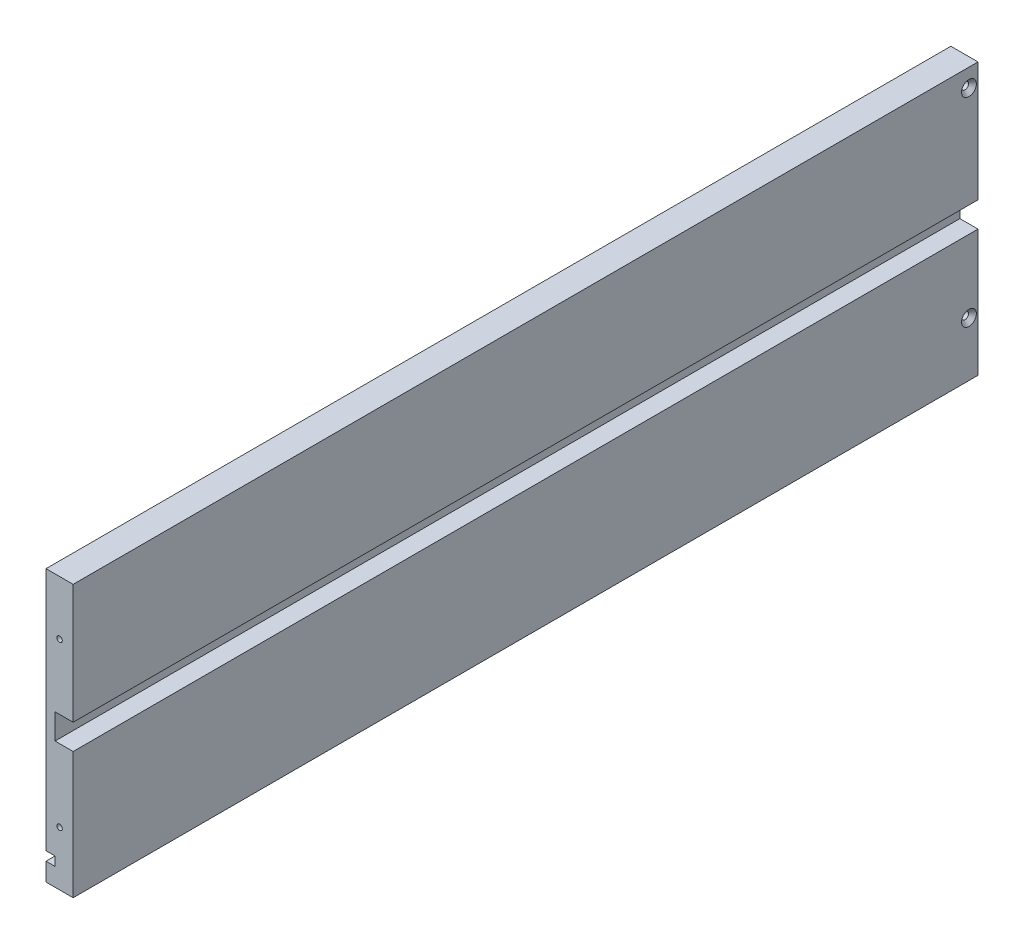
ISO-10303-21;
HEADER;
FILE_DESCRIPTION(('STEP AP214'),'2;1');
FILE_NAME('part.step','',(''),(''),'','','');
FILE_SCHEMA(('AUTOMOTIVE_DESIGN { 1 0 10303 214 1 1 1 1 }'));
ENDSEC;
DATA;
#1=APPLICATION_CONTEXT('core data for automotive mechanical design processes');
#2=APPLICATION_PROTOCOL_DEFINITION('international standard','automotive_design',2000,#1);
#3=PRODUCT_CONTEXT('',#1,'mechanical');
#4=PRODUCT('Part','Part','',(#3));
#5=PRODUCT_RELATED_PRODUCT_CATEGORY('part','',(#4));
#6=PRODUCT_DEFINITION_FORMATION('','',#4);
#7=PRODUCT_DEFINITION_CONTEXT('part definition',#1,'design');
#8=PRODUCT_DEFINITION('design','',#6,#7);
#9=PRODUCT_DEFINITION_SHAPE('','',#8);
#10=(LENGTH_UNIT() NAMED_UNIT(*) SI_UNIT(.MILLI.,.METRE.));
#11=(NAMED_UNIT(*) PLANE_ANGLE_UNIT() SI_UNIT($,.RADIAN.));
#12=(NAMED_UNIT(*) SI_UNIT($,.STERADIAN.) SOLID_ANGLE_UNIT());
#13=UNCERTAINTY_MEASURE_WITH_UNIT(LENGTH_MEASURE(1.E-05),#10,'distance_accuracy_value','');
#14=(GEOMETRIC_REPRESENTATION_CONTEXT(3) GLOBAL_UNCERTAINTY_ASSIGNED_CONTEXT((#13)) GLOBAL_UNIT_ASSIGNED_CONTEXT((#10,
#11,#12)) REPRESENTATION_CONTEXT('',''));
#15=CARTESIAN_POINT('',(0.,0.,0.));
#16=DIRECTION('',(0.,0.,1.));
#17=DIRECTION('',(1.,0.,0.));
#18=AXIS2_PLACEMENT_3D('',#15,#16,#17);
#19=CARTESIAN_POINT('',(-15.,150.,0.));
#20=DIRECTION('',(-1.,0.,0.));
#21=DIRECTION('',(0.,0.,1.));
#22=AXIS2_PLACEMENT_3D('',#19,#20,#21);
#23=PLANE('',#22);
#24=CARTESIAN_POINT('',(-15.,140.,-495.));
#25=DIRECTION('',(1.,0.,0.));
#26=DIRECTION('',(0.,0.,-1.));
#27=AXIS2_PLACEMENT_3D('',#24,#25,#26);
#28=CIRCLE('',#27,1.95000000000001);
#29=CARTESIAN_POINT('',(-15.,140.,-496.95));
#30=VERTEX_POINT('',#29);
#31=EDGE_CURVE('E147',#30,#30,#28,.T.);
#32=ORIENTED_EDGE('',*,*,#31,.T.);
#33=EDGE_LOOP('',(#32));
#34=FACE_BOUND('',#33,.T.);
#35=CARTESIAN_POINT('',(-15.,30.,-495.));
#36=DIRECTION('',(1.,0.,0.));
#37=DIRECTION('',(0.,0.,-1.));
#38=AXIS2_PLACEMENT_3D('',#35,#36,#37);
#39=CIRCLE('',#38,1.94999999999999);
#40=CARTESIAN_POINT('',(-15.,30.,-496.95));
#41=VERTEX_POINT('',#40);
#42=EDGE_CURVE('E156',#41,#41,#39,.T.);
#43=ORIENTED_EDGE('',*,*,#42,.T.);
#44=EDGE_LOOP('',(#43));
#45=FACE_BOUND('',#44,.T.);
#46=DIRECTION('',(0.,0.,1.));
#47=VECTOR('',#46,1.);
#48=CARTESIAN_POINT('',(-15.,15.,-500.));
#49=LINE('',#48,#47);
#50=CARTESIAN_POINT('',(-15.,15.,-500.));
#51=VERTEX_POINT('',#50);
#52=CARTESIAN_POINT('',(-15.,15.,0.));
#53=VERTEX_POINT('',#52);
#54=EDGE_CURVE('E181',#51,#53,#49,.T.);
#55=ORIENTED_EDGE('',*,*,#54,.T.);
#56=DIRECTION('',(0.,-1.,0.));
#57=VECTOR('',#56,1.);
#58=CARTESIAN_POINT('',(-15.,0.,0.));
#59=LINE('',#58,#57);
#60=CARTESIAN_POINT('',(-15.,150.,0.));
#61=VERTEX_POINT('',#60);
#62=EDGE_CURVE('E214',#61,#53,#59,.T.);
#63=ORIENTED_EDGE('',*,*,#62,.F.);
#64=DIRECTION('',(0.,0.,1.));
#65=VECTOR('',#64,1.);
#66=CARTESIAN_POINT('',(-15.,150.,0.));
#67=LINE('',#66,#65);
#68=CARTESIAN_POINT('',(-15.,150.,-500.));
#69=VERTEX_POINT('',#68);
#70=EDGE_CURVE('E225',#69,#61,#67,.T.);
#71=ORIENTED_EDGE('',*,*,#70,.F.);
#72=DIRECTION('',(0.,1.,0.));
#73=VECTOR('',#72,1.);
#74=CARTESIAN_POINT('',(-15.,0.,-500.));
#75=LINE('',#74,#73);
#76=EDGE_CURVE('E221',#51,#69,#75,.T.);
#77=ORIENTED_EDGE('',*,*,#76,.F.);
#78=EDGE_LOOP('',(#55,#63,#71,#77));
#79=FACE_BOUND('',#78,.T.);
#80=ADVANCED_FACE('F33',(#34,#45,#79),#23,.T.);
#81=CARTESIAN_POINT('',(0.,150.,0.));
#82=DIRECTION('',(-1.,0.,0.));
#83=DIRECTION('',(0.,0.,1.));
#84=AXIS2_PLACEMENT_3D('',#81,#82,#83);
#85=PLANE('',#84);
#86=CARTESIAN_POINT('',(0.,30.,-495.));
#87=DIRECTION('',(1.,0.,0.));
#88=DIRECTION('',(0.,0.,-1.));
#89=AXIS2_PLACEMENT_3D('',#86,#87,#88);
#90=CIRCLE('',#89,4.1);
#91=CARTESIAN_POINT('',(0.,30.,-499.1));
#92=VERTEX_POINT('',#91);
#93=EDGE_CURVE('E162',#92,#92,#90,.T.);
#94=ORIENTED_EDGE('',*,*,#93,.F.);
#95=EDGE_LOOP('',(#94));
#96=FACE_BOUND('',#95,.T.);
#97=DIRECTION('',(0.,1.,0.));
#98=VECTOR('',#97,1.);
#99=CARTESIAN_POINT('',(0.,0.,-500.));
#100=LINE('',#99,#98);
#101=CARTESIAN_POINT('',(0.,0.,-500.));
#102=VERTEX_POINT('',#101);
#103=CARTESIAN_POINT('',(0.,70.,-500.));
#104=VERTEX_POINT('',#103);
#105=EDGE_CURVE('E235',#102,#104,#100,.T.);
#106=ORIENTED_EDGE('',*,*,#105,.T.);
#107=DIRECTION('',(0.,0.,1.));
#108=VECTOR('',#107,1.);
#109=CARTESIAN_POINT('',(0.,70.,-500.));
#110=LINE('',#109,#108);
#111=CARTESIAN_POINT('',(0.,70.,0.));
#112=VERTEX_POINT('',#111);
#113=EDGE_CURVE('E205',#104,#112,#110,.T.);
#114=ORIENTED_EDGE('',*,*,#113,.T.);
#115=DIRECTION('',(0.,-1.,0.));
#116=VECTOR('',#115,1.);
#117=CARTESIAN_POINT('',(0.,0.,0.));
#118=LINE('',#117,#116);
#119=CARTESIAN_POINT('',(0.,0.,0.));
#120=VERTEX_POINT('',#119);
#121=EDGE_CURVE('E208',#112,#120,#118,.T.);
#122=ORIENTED_EDGE('',*,*,#121,.T.);
#123=DIRECTION('',(0.,0.,-1.));
#124=VECTOR('',#123,1.);
#125=CARTESIAN_POINT('',(0.,0.,0.));
#126=LINE('',#125,#124);
#127=EDGE_CURVE('E231',#120,#102,#126,.T.);
#128=ORIENTED_EDGE('',*,*,#127,.T.);
#129=EDGE_LOOP('',(#106,#114,#122,#128));
#130=FACE_BOUND('',#129,.T.);
#131=ADVANCED_FACE('F257',(#96,#130),#85,.F.);
#132=CARTESIAN_POINT('',(-15.,0.,0.));
#133=DIRECTION('',(0.,0.,1.));
#134=DIRECTION('',(1.,0.,0.));
#135=AXIS2_PLACEMENT_3D('',#132,#133,#134);
#136=PLANE('',#135);
#137=CARTESIAN_POINT('',(-7.5,30.,0.));
#138=DIRECTION('',(0.,0.,1.));
#139=DIRECTION('',(1.,0.,0.));
#140=AXIS2_PLACEMENT_3D('',#137,#138,#139);
#141=CIRCLE('',#140,1.5);
#142=CARTESIAN_POINT('',(-6.00000000000001,30.,0.));
#143=VERTEX_POINT('',#142);
#144=EDGE_CURVE('E136',#143,#143,#141,.T.);
#145=ORIENTED_EDGE('',*,*,#144,.F.);
#146=EDGE_LOOP('',(#145));
#147=FACE_BOUND('',#146,.T.);
#148=CARTESIAN_POINT('',(-7.50000000000001,120.,0.));
#149=DIRECTION('',(0.,0.,1.));
#150=DIRECTION('',(1.,0.,0.));
#151=AXIS2_PLACEMENT_3D('',#148,#149,#150);
#152=CIRCLE('',#151,1.5);
#153=CARTESIAN_POINT('',(-6.00000000000002,120.,0.));
#154=VERTEX_POINT('',#153);
#155=EDGE_CURVE('E144',#154,#154,#152,.T.);
#156=ORIENTED_EDGE('',*,*,#155,.F.);
#157=EDGE_LOOP('',(#156));
#158=FACE_BOUND('',#157,.T.);
#159=DIRECTION('',(-1.,0.,0.));
#160=VECTOR('',#159,1.);
#161=CARTESIAN_POINT('',(-15.,15.,0.));
#162=LINE('',#161,#160);
#163=CARTESIAN_POINT('',(-10.,15.,0.));
#164=VERTEX_POINT('',#163);
#165=EDGE_CURVE('E168',#164,#53,#162,.T.);
#166=ORIENTED_EDGE('',*,*,#165,.F.);
#167=DIRECTION('',(0.,1.,0.));
#168=VECTOR('',#167,1.);
#169=CARTESIAN_POINT('',(-10.,10.,0.));
#170=LINE('',#169,#168);
#171=CARTESIAN_POINT('',(-10.,10.,0.));
#172=VERTEX_POINT('',#171);
#173=EDGE_CURVE('E177',#172,#164,#170,.T.);
#174=ORIENTED_EDGE('',*,*,#173,.F.);
#175=DIRECTION('',(1.,0.,0.));
#176=VECTOR('',#175,1.);
#177=CARTESIAN_POINT('',(-15.,10.,0.));
#178=LINE('',#177,#176);
#179=CARTESIAN_POINT('',(-15.,10.,0.));
#180=VERTEX_POINT('',#179);
#181=EDGE_CURVE('E165',#180,#172,#178,.T.);
#182=ORIENTED_EDGE('',*,*,#181,.F.);
#183=CARTESIAN_POINT('',(-15.,0.,0.));
#184=VERTEX_POINT('',#183);
#185=EDGE_CURVE('E218',#180,#184,#59,.T.);
#186=ORIENTED_EDGE('',*,*,#185,.T.);
#187=DIRECTION('',(1.,0.,0.));
#188=VECTOR('',#187,1.);
#189=CARTESIAN_POINT('',(-15.,0.,0.));
#190=LINE('',#189,#188);
#191=EDGE_CURVE('E37',#184,#120,#190,.T.);
#192=ORIENTED_EDGE('',*,*,#191,.T.);
#193=ORIENTED_EDGE('',*,*,#121,.F.);
#194=DIRECTION('',(1.,0.,0.));
#195=VECTOR('',#194,1.);
#196=CARTESIAN_POINT('',(0.,70.,0.));
#197=LINE('',#196,#195);
#198=CARTESIAN_POINT('',(-10.,70.,0.));
#199=VERTEX_POINT('',#198);
#200=EDGE_CURVE('E192',#199,#112,#197,.T.);
#201=ORIENTED_EDGE('',*,*,#200,.F.);
#202=DIRECTION('',(0.,-1.,0.));
#203=VECTOR('',#202,1.);
#204=CARTESIAN_POINT('',(-10.,70.,0.));
#205=LINE('',#204,#203);
#206=CARTESIAN_POINT('',(-10.,84.,0.));
#207=VERTEX_POINT('',#206);
#208=EDGE_CURVE('E201',#207,#199,#205,.T.);
#209=ORIENTED_EDGE('',*,*,#208,.F.);
#210=DIRECTION('',(-1.,0.,0.));
#211=VECTOR('',#210,1.);
#212=CARTESIAN_POINT('',(0.,84.,0.));
#213=LINE('',#212,#211);
#214=CARTESIAN_POINT('',(0.,84.,0.));
#215=VERTEX_POINT('',#214);
#216=EDGE_CURVE('E184',#215,#207,#213,.T.);
#217=ORIENTED_EDGE('',*,*,#216,.F.);
#218=CARTESIAN_POINT('',(0.,150.,0.));
#219=VERTEX_POINT('',#218);
#220=EDGE_CURVE('E228',#219,#215,#118,.T.);
#221=ORIENTED_EDGE('',*,*,#220,.F.);
#222=DIRECTION('',(1.,0.,0.));
#223=VECTOR('',#222,1.);
#224=CARTESIAN_POINT('',(-15.,150.,0.));
#225=LINE('',#224,#223);
#226=EDGE_CURVE('E11',#61,#219,#225,.T.);
#227=ORIENTED_EDGE('',*,*,#226,.F.);
#228=ORIENTED_EDGE('',*,*,#62,.T.);
#229=EDGE_LOOP('',(#166,#174,#182,#186,#192,#193,#201,#209,#217,#221,#227,#228));
#230=FACE_BOUND('',#229,.T.);
#231=ADVANCED_FACE('F35',(#147,#158,#230),#136,.T.);
#232=CARTESIAN_POINT('',(-15.,150.,0.));
#233=DIRECTION('',(0.,1.,0.));
#234=DIRECTION('',(0.,0.,1.));
#235=AXIS2_PLACEMENT_3D('',#232,#233,#234);
#236=PLANE('',#235);
#237=DIRECTION('',(0.,0.,1.));
#238=VECTOR('',#237,1.);
#239=CARTESIAN_POINT('',(0.,150.,0.));
#240=LINE('',#239,#238);
#241=CARTESIAN_POINT('',(0.,150.,-500.));
#242=VERTEX_POINT('',#241);
#243=EDGE_CURVE('E238',#242,#219,#240,.T.);
#244=ORIENTED_EDGE('',*,*,#243,.F.);
#245=DIRECTION('',(1.,0.,0.));
#246=VECTOR('',#245,1.);
#247=CARTESIAN_POINT('',(-15.,150.,-500.));
#248=LINE('',#247,#246);
#249=EDGE_CURVE('E42',#69,#242,#248,.T.);
#250=ORIENTED_EDGE('',*,*,#249,.F.);
#251=ORIENTED_EDGE('',*,*,#70,.T.);
#252=ORIENTED_EDGE('',*,*,#226,.T.);
#253=EDGE_LOOP('',(#244,#250,#251,#252));
#254=FACE_BOUND('',#253,.T.);
#255=ADVANCED_FACE('F275',(#254),#236,.T.);
#256=CARTESIAN_POINT('',(-15.,0.,-500.));
#257=DIRECTION('',(0.,0.,-1.));
#258=DIRECTION('',(-1.,0.,0.));
#259=AXIS2_PLACEMENT_3D('',#256,#257,#258);
#260=PLANE('',#259);
#261=DIRECTION('',(-1.,0.,0.));
#262=VECTOR('',#261,1.);
#263=CARTESIAN_POINT('',(-15.,15.,-500.));
#264=LINE('',#263,#262);
#265=CARTESIAN_POINT('',(-10.,15.,-500.));
#266=VERTEX_POINT('',#265);
#267=EDGE_CURVE('E171',#266,#51,#264,.T.);
#268=ORIENTED_EDGE('',*,*,#267,.T.);
#269=ORIENTED_EDGE('',*,*,#76,.T.);
#270=ORIENTED_EDGE('',*,*,#249,.T.);
#271=CARTESIAN_POINT('',(0.,84.,-500.));
#272=VERTEX_POINT('',#271);
#273=EDGE_CURVE('E234',#272,#242,#100,.T.);
#274=ORIENTED_EDGE('',*,*,#273,.F.);
#275=DIRECTION('',(-1.,0.,0.));
#276=VECTOR('',#275,1.);
#277=CARTESIAN_POINT('',(0.,84.,-500.));
#278=LINE('',#277,#276);
#279=CARTESIAN_POINT('',(-10.,84.,-500.));
#280=VERTEX_POINT('',#279);
#281=EDGE_CURVE('E58',#272,#280,#278,.T.);
#282=ORIENTED_EDGE('',*,*,#281,.T.);
#283=DIRECTION('',(0.,-1.,0.));
#284=VECTOR('',#283,1.);
#285=CARTESIAN_POINT('',(-10.,70.,-500.));
#286=LINE('',#285,#284);
#287=CARTESIAN_POINT('',(-10.,70.,-500.));
#288=VERTEX_POINT('',#287);
#289=EDGE_CURVE('E191',#280,#288,#286,.T.);
#290=ORIENTED_EDGE('',*,*,#289,.T.);
#291=DIRECTION('',(1.,0.,0.));
#292=VECTOR('',#291,1.);
#293=CARTESIAN_POINT('',(0.,70.,-500.));
#294=LINE('',#293,#292);
#295=EDGE_CURVE('E195',#288,#104,#294,.T.);
#296=ORIENTED_EDGE('',*,*,#295,.T.);
#297=ORIENTED_EDGE('',*,*,#105,.F.);
#298=DIRECTION('',(1.,0.,0.));
#299=VECTOR('',#298,1.);
#300=CARTESIAN_POINT('',(-15.,0.,-500.));
#301=LINE('',#300,#299);
#302=CARTESIAN_POINT('',(-15.,0.,-500.));
#303=VERTEX_POINT('',#302);
#304=EDGE_CURVE('E242',#303,#102,#301,.T.);
#305=ORIENTED_EDGE('',*,*,#304,.F.);
#306=CARTESIAN_POINT('',(-15.,10.,-500.));
#307=VERTEX_POINT('',#306);
#308=EDGE_CURVE('E222',#303,#307,#75,.T.);
#309=ORIENTED_EDGE('',*,*,#308,.T.);
#310=DIRECTION('',(1.,0.,0.));
#311=VECTOR('',#310,1.);
#312=CARTESIAN_POINT('',(-15.,10.,-500.));
#313=LINE('',#312,#311);
#314=CARTESIAN_POINT('',(-10.,10.,-500.));
#315=VERTEX_POINT('',#314);
#316=EDGE_CURVE('E50',#307,#315,#313,.T.);
#317=ORIENTED_EDGE('',*,*,#316,.T.);
#318=DIRECTION('',(0.,1.,0.));
#319=VECTOR('',#318,1.);
#320=CARTESIAN_POINT('',(-10.,10.,-500.));
#321=LINE('',#320,#319);
#322=EDGE_CURVE('E167',#315,#266,#321,.T.);
#323=ORIENTED_EDGE('',*,*,#322,.T.);
#324=EDGE_LOOP('',(#268,#269,#270,#274,#282,#290,#296,#297,#305,#309,#317,#323));
#325=FACE_BOUND('',#324,.T.);
#326=ADVANCED_FACE('F262',(#325),#260,.T.);
#327=CARTESIAN_POINT('',(-15.,0.,0.));
#328=DIRECTION('',(0.,-1.,0.));
#329=DIRECTION('',(0.,0.,-1.));
#330=AXIS2_PLACEMENT_3D('',#327,#328,#329);
#331=PLANE('',#330);
#332=ORIENTED_EDGE('',*,*,#127,.F.);
#333=ORIENTED_EDGE('',*,*,#191,.F.);
#334=DIRECTION('',(0.,0.,-1.));
#335=VECTOR('',#334,1.);
#336=CARTESIAN_POINT('',(-15.,0.,0.));
#337=LINE('',#336,#335);
#338=EDGE_CURVE('E217',#184,#303,#337,.T.);
#339=ORIENTED_EDGE('',*,*,#338,.T.);
#340=ORIENTED_EDGE('',*,*,#304,.T.);
#341=EDGE_LOOP('',(#332,#333,#339,#340));
#342=FACE_BOUND('',#341,.T.);
#343=ADVANCED_FACE('F255',(#342),#331,.T.);
#344=DIRECTION('',(0.,0.,1.));
#345=VECTOR('',#344,1.);
#346=CARTESIAN_POINT('',(-15.,10.,-500.));
#347=LINE('',#346,#345);
#348=EDGE_CURVE('E174',#307,#180,#347,.T.);
#349=ORIENTED_EDGE('',*,*,#348,.F.);
#350=ORIENTED_EDGE('',*,*,#308,.F.);
#351=ORIENTED_EDGE('',*,*,#338,.F.);
#352=ORIENTED_EDGE('',*,*,#185,.F.);
#353=EDGE_LOOP('',(#349,#350,#351,#352));
#354=FACE_BOUND('',#353,.T.);
#355=ADVANCED_FACE('F288',(#354),#23,.T.);
#356=CARTESIAN_POINT('',(0.,140.,-495.));
#357=DIRECTION('',(1.,0.,0.));
#358=DIRECTION('',(0.,0.,-1.));
#359=AXIS2_PLACEMENT_3D('',#356,#357,#358);
#360=CIRCLE('',#359,4.09999999999999);
#361=CARTESIAN_POINT('',(0.,140.,-499.1));
#362=VERTEX_POINT('',#361);
#363=EDGE_CURVE('E153',#362,#362,#360,.T.);
#364=ORIENTED_EDGE('',*,*,#363,.F.);
#365=EDGE_LOOP('',(#364));
#366=FACE_BOUND('',#365,.T.);
#367=ORIENTED_EDGE('',*,*,#220,.T.);
#368=DIRECTION('',(0.,0.,1.));
#369=VECTOR('',#368,1.);
#370=CARTESIAN_POINT('',(0.,84.,-500.));
#371=LINE('',#370,#369);
#372=EDGE_CURVE('E198',#272,#215,#371,.T.);
#373=ORIENTED_EDGE('',*,*,#372,.F.);
#374=ORIENTED_EDGE('',*,*,#273,.T.);
#375=ORIENTED_EDGE('',*,*,#243,.T.);
#376=EDGE_LOOP('',(#367,#373,#374,#375));
#377=FACE_BOUND('',#376,.T.);
#378=ADVANCED_FACE('F271',(#366,#377),#85,.F.);
#379=CARTESIAN_POINT('',(0.,70.,-500.));
#380=DIRECTION('',(0.,-1.,0.));
#381=DIRECTION('',(0.,0.,-1.));
#382=AXIS2_PLACEMENT_3D('',#379,#380,#381);
#383=PLANE('',#382);
#384=ORIENTED_EDGE('',*,*,#200,.T.);
#385=ORIENTED_EDGE('',*,*,#113,.F.);
#386=ORIENTED_EDGE('',*,*,#295,.F.);
#387=DIRECTION('',(0.,0.,1.));
#388=VECTOR('',#387,1.);
#389=CARTESIAN_POINT('',(-10.,70.,-500.));
#390=LINE('',#389,#388);
#391=EDGE_CURVE('E209',#288,#199,#390,.T.);
#392=ORIENTED_EDGE('',*,*,#391,.T.);
#393=EDGE_LOOP('',(#384,#385,#386,#392));
#394=FACE_BOUND('',#393,.T.);
#395=ADVANCED_FACE('F260',(#394),#383,.F.);
#396=CARTESIAN_POINT('',(-10.,70.,-500.));
#397=DIRECTION('',(-1.,0.,0.));
#398=DIRECTION('',(0.,0.,1.));
#399=AXIS2_PLACEMENT_3D('',#396,#397,#398);
#400=PLANE('',#399);
#401=ORIENTED_EDGE('',*,*,#208,.T.);
#402=ORIENTED_EDGE('',*,*,#391,.F.);
#403=ORIENTED_EDGE('',*,*,#289,.F.);
#404=DIRECTION('',(0.,0.,1.));
#405=VECTOR('',#404,1.);
#406=CARTESIAN_POINT('',(-10.,84.,-500.));
#407=LINE('',#406,#405);
#408=EDGE_CURVE('E211',#280,#207,#407,.T.);
#409=ORIENTED_EDGE('',*,*,#408,.T.);
#410=EDGE_LOOP('',(#401,#402,#403,#409));
#411=FACE_BOUND('',#410,.T.);
#412=ADVANCED_FACE('F266',(#411),#400,.F.);
#413=CARTESIAN_POINT('',(0.,84.,-500.));
#414=DIRECTION('',(0.,1.,0.));
#415=DIRECTION('',(0.,0.,1.));
#416=AXIS2_PLACEMENT_3D('',#413,#414,#415);
#417=PLANE('',#416);
#418=ORIENTED_EDGE('',*,*,#216,.T.);
#419=ORIENTED_EDGE('',*,*,#408,.F.);
#420=ORIENTED_EDGE('',*,*,#281,.F.);
#421=ORIENTED_EDGE('',*,*,#372,.T.);
#422=EDGE_LOOP('',(#418,#419,#420,#421));
#423=FACE_BOUND('',#422,.T.);
#424=ADVANCED_FACE('F360',(#423),#417,.F.);
#425=CARTESIAN_POINT('',(-15.,15.,-500.));
#426=DIRECTION('',(0.,1.,0.));
#427=DIRECTION('',(0.,0.,1.));
#428=AXIS2_PLACEMENT_3D('',#425,#426,#427);
#429=PLANE('',#428);
#430=ORIENTED_EDGE('',*,*,#165,.T.);
#431=ORIENTED_EDGE('',*,*,#54,.F.);
#432=ORIENTED_EDGE('',*,*,#267,.F.);
#433=DIRECTION('',(0.,0.,1.));
#434=VECTOR('',#433,1.);
#435=CARTESIAN_POINT('',(-10.,15.,-500.));
#436=LINE('',#435,#434);
#437=EDGE_CURVE('E185',#266,#164,#436,.T.);
#438=ORIENTED_EDGE('',*,*,#437,.T.);
#439=EDGE_LOOP('',(#430,#431,#432,#438));
#440=FACE_BOUND('',#439,.T.);
#441=ADVANCED_FACE('F282',(#440),#429,.F.);
#442=CARTESIAN_POINT('',(-10.,10.,-500.));
#443=DIRECTION('',(1.,0.,0.));
#444=DIRECTION('',(0.,0.,-1.));
#445=AXIS2_PLACEMENT_3D('',#442,#443,#444);
#446=PLANE('',#445);
#447=ORIENTED_EDGE('',*,*,#173,.T.);
#448=ORIENTED_EDGE('',*,*,#437,.F.);
#449=ORIENTED_EDGE('',*,*,#322,.F.);
#450=DIRECTION('',(0.,0.,1.));
#451=VECTOR('',#450,1.);
#452=CARTESIAN_POINT('',(-10.,10.,-500.));
#453=LINE('',#452,#451);
#454=EDGE_CURVE('E187',#315,#172,#453,.T.);
#455=ORIENTED_EDGE('',*,*,#454,.T.);
#456=EDGE_LOOP('',(#447,#448,#449,#455));
#457=FACE_BOUND('',#456,.T.);
#458=ADVANCED_FACE('F285',(#457),#446,.F.);
#459=CARTESIAN_POINT('',(-15.,10.,-500.));
#460=DIRECTION('',(0.,-1.,0.));
#461=DIRECTION('',(1.,0.,0.));
#462=AXIS2_PLACEMENT_3D('',#459,#460,#461);
#463=PLANE('',#462);
#464=ORIENTED_EDGE('',*,*,#181,.T.);
#465=ORIENTED_EDGE('',*,*,#454,.F.);
#466=ORIENTED_EDGE('',*,*,#316,.F.);
#467=ORIENTED_EDGE('',*,*,#348,.T.);
#468=EDGE_LOOP('',(#464,#465,#466,#467));
#469=FACE_BOUND('',#468,.T.);
#470=ADVANCED_FACE('F290',(#469),#463,.F.);
#471=CARTESIAN_POINT('',(0.,30.,-495.));
#472=DIRECTION('',(1.,0.,0.));
#473=DIRECTION('',(0.,0.,-1.));
#474=AXIS2_PLACEMENT_3D('',#471,#472,#473);
#475=CONICAL_SURFACE('',#474,4.1,0.785398163397448);
#476=CARTESIAN_POINT('',(-2.15,30.,-495.));
#477=DIRECTION('',(1.,0.,0.));
#478=DIRECTION('',(0.,0.,-1.));
#479=AXIS2_PLACEMENT_3D('',#476,#477,#478);
#480=CIRCLE('',#479,1.95);
#481=CARTESIAN_POINT('',(-2.15,30.,-496.95));
#482=VERTEX_POINT('',#481);
#483=EDGE_CURVE('E159',#482,#482,#480,.T.);
#484=ORIENTED_EDGE('',*,*,#483,.F.);
#485=EDGE_LOOP('',(#484));
#486=FACE_BOUND('',#485,.T.);
#487=ORIENTED_EDGE('',*,*,#93,.T.);
#488=EDGE_LOOP('',(#487));
#489=FACE_BOUND('',#488,.T.);
#490=ADVANCED_FACE('F292',(#486,#489),#475,.F.);
#491=CARTESIAN_POINT('',(0.,30.,-495.));
#492=DIRECTION('',(1.,0.,0.));
#493=DIRECTION('',(0.,0.,-1.));
#494=AXIS2_PLACEMENT_3D('',#491,#492,#493);
#495=CYLINDRICAL_SURFACE('',#494,1.95);
#496=ORIENTED_EDGE('',*,*,#42,.F.);
#497=EDGE_LOOP('',(#496));
#498=FACE_BOUND('',#497,.T.);
#499=ORIENTED_EDGE('',*,*,#483,.T.);
#500=EDGE_LOOP('',(#499));
#501=FACE_BOUND('',#500,.T.);
#502=ADVANCED_FACE('F298',(#498,#501),#495,.F.);
#503=CARTESIAN_POINT('',(0.,140.,-495.));
#504=DIRECTION('',(1.,0.,0.));
#505=DIRECTION('',(0.,0.,-1.));
#506=AXIS2_PLACEMENT_3D('',#503,#504,#505);
#507=CONICAL_SURFACE('',#506,4.09999999999999,0.785398163397445);
#508=CARTESIAN_POINT('',(-2.15,140.,-495.));
#509=DIRECTION('',(1.,0.,0.));
#510=DIRECTION('',(0.,0.,-1.));
#511=AXIS2_PLACEMENT_3D('',#508,#509,#510);
#512=CIRCLE('',#511,1.95000000000001);
#513=CARTESIAN_POINT('',(-2.15,140.,-496.95));
#514=VERTEX_POINT('',#513);
#515=EDGE_CURVE('E150',#514,#514,#512,.T.);
#516=ORIENTED_EDGE('',*,*,#515,.F.);
#517=EDGE_LOOP('',(#516));
#518=FACE_BOUND('',#517,.T.);
#519=ORIENTED_EDGE('',*,*,#363,.T.);
#520=EDGE_LOOP('',(#519));
#521=FACE_BOUND('',#520,.T.);
#522=ADVANCED_FACE('F347',(#518,#521),#507,.F.);
#523=CARTESIAN_POINT('',(0.,140.,-495.));
#524=DIRECTION('',(1.,0.,0.));
#525=DIRECTION('',(0.,0.,-1.));
#526=AXIS2_PLACEMENT_3D('',#523,#524,#525);
#527=CYLINDRICAL_SURFACE('',#526,1.95000000000001);
#528=ORIENTED_EDGE('',*,*,#31,.F.);
#529=EDGE_LOOP('',(#528));
#530=FACE_BOUND('',#529,.T.);
#531=ORIENTED_EDGE('',*,*,#515,.T.);
#532=EDGE_LOOP('',(#531));
#533=FACE_BOUND('',#532,.T.);
#534=ADVANCED_FACE('F338',(#530,#533),#527,.F.);
#535=CARTESIAN_POINT('',(-7.50000000000001,120.,0.));
#536=DIRECTION('',(0.,0.,1.));
#537=DIRECTION('',(1.,0.,0.));
#538=AXIS2_PLACEMENT_3D('',#535,#536,#537);
#539=CYLINDRICAL_SURFACE('',#538,1.5);
#540=CARTESIAN_POINT('',(-7.50000000000001,120.,-10.));
#541=DIRECTION('',(0.,0.,1.));
#542=DIRECTION('',(1.,0.,0.));
#543=AXIS2_PLACEMENT_3D('',#540,#541,#542);
#544=CIRCLE('',#543,1.5);
#545=CARTESIAN_POINT('',(-6.00000000000002,120.,-10.));
#546=VERTEX_POINT('',#545);
#547=EDGE_CURVE('E139',#546,#546,#544,.T.);
#548=ORIENTED_EDGE('',*,*,#547,.F.);
#549=EDGE_LOOP('',(#548));
#550=FACE_BOUND('',#549,.T.);
#551=ORIENTED_EDGE('',*,*,#155,.T.);
#552=EDGE_LOOP('',(#551));
#553=FACE_BOUND('',#552,.T.);
#554=ADVANCED_FACE('F335',(#550,#553),#539,.F.);
#555=CARTESIAN_POINT('',(-7.50000000000001,120.,-10.));
#556=DIRECTION('',(0.,0.,1.));
#557=DIRECTION('',(1.,0.,0.));
#558=AXIS2_PLACEMENT_3D('',#555,#556,#557);
#559=CONICAL_SURFACE('',#558,1.5,1.02974425867665);
#560=CARTESIAN_POINT('',(-7.50000000000002,120.,-10.9012909285413));
#561=VERTEX_POINT('',#560);
#562=VERTEX_LOOP('',#561);
#563=FACE_BOUND('',#562,.T.);
#564=ORIENTED_EDGE('',*,*,#547,.T.);
#565=EDGE_LOOP('',(#564));
#566=FACE_BOUND('',#565,.T.);
#567=ADVANCED_FACE('F337',(#563,#566),#559,.F.);
#568=CARTESIAN_POINT('',(-7.5,30.,0.));
#569=DIRECTION('',(0.,0.,1.));
#570=DIRECTION('',(1.,0.,0.));
#571=AXIS2_PLACEMENT_3D('',#568,#569,#570);
#572=CYLINDRICAL_SURFACE('',#571,1.5);
#573=CARTESIAN_POINT('',(-7.5,30.,-10.));
#574=DIRECTION('',(0.,0.,1.));
#575=DIRECTION('',(1.,0.,0.));
#576=AXIS2_PLACEMENT_3D('',#573,#574,#575);
#577=CIRCLE('',#576,1.5);
#578=CARTESIAN_POINT('',(-6.00000000000001,30.,-10.));
#579=VERTEX_POINT('',#578);
#580=EDGE_CURVE('E134',#579,#579,#577,.T.);
#581=ORIENTED_EDGE('',*,*,#580,.F.);
#582=EDGE_LOOP('',(#581));
#583=FACE_BOUND('',#582,.T.);
#584=ORIENTED_EDGE('',*,*,#144,.T.);
#585=EDGE_LOOP('',(#584));
#586=FACE_BOUND('',#585,.T.);
#587=ADVANCED_FACE('F130',(#583,#586),#572,.F.);
#588=CARTESIAN_POINT('',(-7.5,30.,-10.));
#589=DIRECTION('',(0.,0.,1.));
#590=DIRECTION('',(1.,0.,0.));
#591=AXIS2_PLACEMENT_3D('',#588,#589,#590);
#592=CONICAL_SURFACE('',#591,1.5,1.02974425867665);
#593=CARTESIAN_POINT('',(-7.50000000000001,30.,-10.9012909285413));
#594=VERTEX_POINT('',#593);
#595=VERTEX_LOOP('',#594);
#596=FACE_BOUND('',#595,.T.);
#597=ORIENTED_EDGE('',*,*,#580,.T.);
#598=EDGE_LOOP('',(#597));
#599=FACE_BOUND('',#598,.T.);
#600=ADVANCED_FACE('F127',(#596,#599),#592,.F.);
#601=CLOSED_SHELL('',(#80,#131,#231,#255,#326,#343,#355,#378,#395,#412,#424,#441,#458,#470,#490,
#502,#522,#534,#554,#567,#587,#600));
#602=MANIFOLD_SOLID_BREP('B2',#601);
#603=ADVANCED_BREP_SHAPE_REPRESENTATION('',(#18,#602),#14);
#604=SHAPE_DEFINITION_REPRESENTATION(#9,#603);
ENDSEC;
END-ISO-10303-21;
